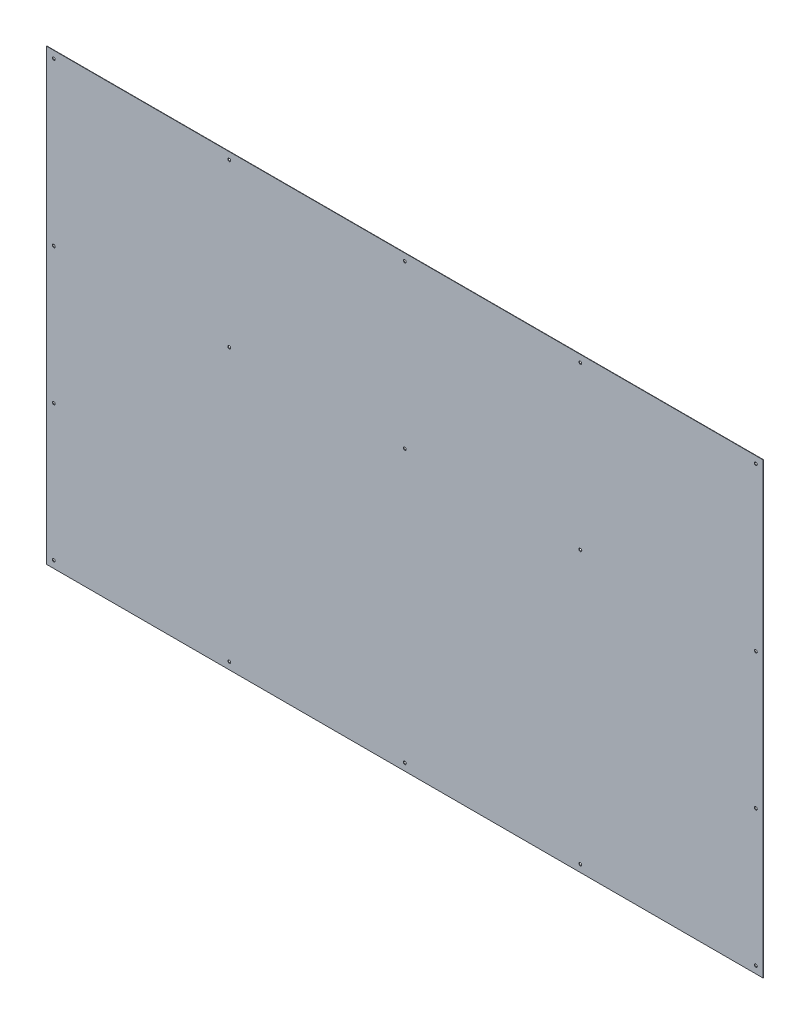
ISO-10303-21;
HEADER;
FILE_DESCRIPTION(('STEP AP214'),'2;1');
FILE_NAME('part.step','',(''),(''),'','','');
FILE_SCHEMA(('AUTOMOTIVE_DESIGN { 1 0 10303 214 1 1 1 1 }'));
ENDSEC;
DATA;
#1=APPLICATION_CONTEXT('core data for automotive mechanical design processes');
#2=APPLICATION_PROTOCOL_DEFINITION('international standard','automotive_design',2000,#1);
#3=PRODUCT_CONTEXT('',#1,'mechanical');
#4=PRODUCT('Part','Part','',(#3));
#5=PRODUCT_RELATED_PRODUCT_CATEGORY('part','',(#4));
#6=PRODUCT_DEFINITION_FORMATION('','',#4);
#7=PRODUCT_DEFINITION_CONTEXT('part definition',#1,'design');
#8=PRODUCT_DEFINITION('design','',#6,#7);
#9=PRODUCT_DEFINITION_SHAPE('','',#8);
#10=(LENGTH_UNIT() NAMED_UNIT(*) SI_UNIT(.MILLI.,.METRE.));
#11=(NAMED_UNIT(*) PLANE_ANGLE_UNIT() SI_UNIT($,.RADIAN.));
#12=(NAMED_UNIT(*) SI_UNIT($,.STERADIAN.) SOLID_ANGLE_UNIT());
#13=UNCERTAINTY_MEASURE_WITH_UNIT(LENGTH_MEASURE(1.E-05),#10,'distance_accuracy_value','');
#14=(GEOMETRIC_REPRESENTATION_CONTEXT(3) GLOBAL_UNCERTAINTY_ASSIGNED_CONTEXT((#13)) GLOBAL_UNIT_ASSIGNED_CONTEXT((#10,
#11,#12)) REPRESENTATION_CONTEXT('',''));
#15=CARTESIAN_POINT('',(0.,0.,0.));
#16=DIRECTION('',(0.,0.,1.));
#17=DIRECTION('',(1.,0.,0.));
#18=AXIS2_PLACEMENT_3D('',#15,#16,#17);
#19=CARTESIAN_POINT('',(0.,0.,1.));
#20=DIRECTION('',(0.,0.,-1.));
#21=DIRECTION('',(-1.,0.,0.));
#22=AXIS2_PLACEMENT_3D('',#19,#20,#21);
#23=PLANE('',#22);
#24=CARTESIAN_POINT('',(490.000000000004,153.5,1.));
#25=DIRECTION('',(0.,0.,-1.));
#26=DIRECTION('',(-1.,0.,0.));
#27=AXIS2_PLACEMENT_3D('',#24,#25,#26);
#28=CIRCLE('',#27,4.);
#29=CARTESIAN_POINT('',(486.000000000004,153.5,1.));
#30=VERTEX_POINT('',#29);
#31=EDGE_CURVE('E11',#30,#30,#28,.T.);
#32=ORIENTED_EDGE('',*,*,#31,.T.);
#33=EDGE_LOOP('',(#32));
#34=FACE_BOUND('',#33,.T.);
#35=CARTESIAN_POINT('',(4.6339008370253E-12,153.5,1.));
#36=DIRECTION('',(0.,0.,-1.));
#37=DIRECTION('',(-1.,0.,0.));
#38=AXIS2_PLACEMENT_3D('',#35,#36,#37);
#39=CIRCLE('',#38,4.00000000000023);
#40=CARTESIAN_POINT('',(-3.99999999999559,153.5,1.));
#41=VERTEX_POINT('',#40);
#42=EDGE_CURVE('E49',#41,#41,#39,.T.);
#43=ORIENTED_EDGE('',*,*,#42,.T.);
#44=EDGE_LOOP('',(#43));
#45=FACE_BOUND('',#44,.T.);
#46=CARTESIAN_POINT('',(-489.999999999995,153.5,1.));
#47=DIRECTION('',(0.,0.,-1.));
#48=DIRECTION('',(-1.,0.,0.));
#49=AXIS2_PLACEMENT_3D('',#46,#47,#48);
#50=CIRCLE('',#49,4.);
#51=CARTESIAN_POINT('',(-493.999999999995,153.5,1.));
#52=VERTEX_POINT('',#51);
#53=EDGE_CURVE('E184',#52,#52,#50,.T.);
#54=ORIENTED_EDGE('',*,*,#53,.T.);
#55=EDGE_LOOP('',(#54));
#56=FACE_BOUND('',#55,.T.);
#57=CARTESIAN_POINT('',(-979.999999999995,153.5,1.));
#58=DIRECTION('',(0.,0.,-1.));
#59=DIRECTION('',(-1.,0.,0.));
#60=AXIS2_PLACEMENT_3D('',#57,#58,#59);
#61=CIRCLE('',#60,4.00000000000023);
#62=CARTESIAN_POINT('',(-983.999999999995,153.5,1.));
#63=VERTEX_POINT('',#62);
#64=EDGE_CURVE('E180',#63,#63,#61,.T.);
#65=ORIENTED_EDGE('',*,*,#64,.T.);
#66=EDGE_LOOP('',(#65));
#67=FACE_BOUND('',#66,.T.);
#68=CARTESIAN_POINT('',(-979.999999999998,-226.5,1.));
#69=DIRECTION('',(0.,0.,-1.));
#70=DIRECTION('',(-1.,0.,0.));
#71=AXIS2_PLACEMENT_3D('',#68,#69,#70);
#72=CIRCLE('',#71,4.00000000000023);
#73=CARTESIAN_POINT('',(-983.999999999998,-226.5,1.));
#74=VERTEX_POINT('',#73);
#75=EDGE_CURVE('E176',#74,#74,#72,.T.);
#76=ORIENTED_EDGE('',*,*,#75,.T.);
#77=EDGE_LOOP('',(#76));
#78=FACE_BOUND('',#77,.T.);
#79=CARTESIAN_POINT('',(-980.,-606.5,1.));
#80=DIRECTION('',(0.,0.,-1.));
#81=DIRECTION('',(-1.,0.,0.));
#82=AXIS2_PLACEMENT_3D('',#79,#80,#81);
#83=CIRCLE('',#82,4.00000000000023);
#84=CARTESIAN_POINT('',(-984.,-606.5,1.));
#85=VERTEX_POINT('',#84);
#86=EDGE_CURVE('E172',#85,#85,#83,.T.);
#87=ORIENTED_EDGE('',*,*,#86,.T.);
#88=EDGE_LOOP('',(#87));
#89=FACE_BOUND('',#88,.T.);
#90=CARTESIAN_POINT('',(-490.,-606.5,1.));
#91=DIRECTION('',(0.,0.,-1.));
#92=DIRECTION('',(-1.,0.,0.));
#93=AXIS2_PLACEMENT_3D('',#90,#91,#92);
#94=CIRCLE('',#93,4.);
#95=CARTESIAN_POINT('',(-494.,-606.5,1.));
#96=VERTEX_POINT('',#95);
#97=EDGE_CURVE('E168',#96,#96,#94,.T.);
#98=ORIENTED_EDGE('',*,*,#97,.T.);
#99=EDGE_LOOP('',(#98));
#100=FACE_BOUND('',#99,.T.);
#101=CARTESIAN_POINT('',(-2.22044604925031E-13,-606.5,1.));
#102=DIRECTION('',(0.,0.,-1.));
#103=DIRECTION('',(-1.,0.,0.));
#104=AXIS2_PLACEMENT_3D('',#101,#102,#103);
#105=CIRCLE('',#104,4.00000000000023);
#106=CARTESIAN_POINT('',(-4.00000000000045,-606.5,1.));
#107=VERTEX_POINT('',#106);
#108=EDGE_CURVE('E164',#107,#107,#105,.T.);
#109=ORIENTED_EDGE('',*,*,#108,.T.);
#110=EDGE_LOOP('',(#109));
#111=FACE_BOUND('',#110,.T.);
#112=CARTESIAN_POINT('',(490.,-606.5,1.));
#113=DIRECTION('',(0.,0.,-1.));
#114=DIRECTION('',(-1.,0.,0.));
#115=AXIS2_PLACEMENT_3D('',#112,#113,#114);
#116=CIRCLE('',#115,4.);
#117=CARTESIAN_POINT('',(486.,-606.5,1.));
#118=VERTEX_POINT('',#117);
#119=EDGE_CURVE('E160',#118,#118,#116,.T.);
#120=ORIENTED_EDGE('',*,*,#119,.T.);
#121=EDGE_LOOP('',(#120));
#122=FACE_BOUND('',#121,.T.);
#123=CARTESIAN_POINT('',(980.,-606.5,1.));
#124=DIRECTION('',(0.,0.,-1.));
#125=DIRECTION('',(-1.,0.,0.));
#126=AXIS2_PLACEMENT_3D('',#123,#124,#125);
#127=CIRCLE('',#126,4.00000000000023);
#128=CARTESIAN_POINT('',(975.999999999999,-606.5,1.));
#129=VERTEX_POINT('',#128);
#130=EDGE_CURVE('E156',#129,#129,#127,.T.);
#131=ORIENTED_EDGE('',*,*,#130,.T.);
#132=EDGE_LOOP('',(#131));
#133=FACE_BOUND('',#132,.T.);
#134=CARTESIAN_POINT('',(980.000000000002,-226.5,1.));
#135=DIRECTION('',(0.,0.,-1.));
#136=DIRECTION('',(-1.,0.,0.));
#137=AXIS2_PLACEMENT_3D('',#134,#135,#136);
#138=CIRCLE('',#137,4.00000000000023);
#139=CARTESIAN_POINT('',(976.000000000002,-226.5,1.));
#140=VERTEX_POINT('',#139);
#141=EDGE_CURVE('E152',#140,#140,#138,.T.);
#142=ORIENTED_EDGE('',*,*,#141,.T.);
#143=EDGE_LOOP('',(#142));
#144=FACE_BOUND('',#143,.T.);
#145=CARTESIAN_POINT('',(980.000000000004,153.5,1.));
#146=DIRECTION('',(0.,0.,-1.));
#147=DIRECTION('',(-1.,0.,0.));
#148=AXIS2_PLACEMENT_3D('',#145,#146,#147);
#149=CIRCLE('',#148,4.00000000000023);
#150=CARTESIAN_POINT('',(976.000000000004,153.5,1.));
#151=VERTEX_POINT('',#150);
#152=EDGE_CURVE('E148',#151,#151,#149,.T.);
#153=ORIENTED_EDGE('',*,*,#152,.T.);
#154=EDGE_LOOP('',(#153));
#155=FACE_BOUND('',#154,.T.);
#156=CARTESIAN_POINT('',(980.,606.5,1.));
#157=DIRECTION('',(0.,0.,-1.));
#158=DIRECTION('',(-1.,0.,0.));
#159=AXIS2_PLACEMENT_3D('',#156,#157,#158);
#160=CIRCLE('',#159,4.00000000000023);
#161=CARTESIAN_POINT('',(975.999999999999,606.5,1.));
#162=VERTEX_POINT('',#161);
#163=EDGE_CURVE('E144',#162,#162,#160,.T.);
#164=ORIENTED_EDGE('',*,*,#163,.T.);
#165=EDGE_LOOP('',(#164));
#166=FACE_BOUND('',#165,.T.);
#167=CARTESIAN_POINT('',(490.,606.5,1.));
#168=DIRECTION('',(0.,0.,-1.));
#169=DIRECTION('',(-1.,0.,0.));
#170=AXIS2_PLACEMENT_3D('',#167,#168,#169);
#171=CIRCLE('',#170,4.);
#172=CARTESIAN_POINT('',(486.,606.5,1.));
#173=VERTEX_POINT('',#172);
#174=EDGE_CURVE('E140',#173,#173,#171,.T.);
#175=ORIENTED_EDGE('',*,*,#174,.T.);
#176=EDGE_LOOP('',(#175));
#177=FACE_BOUND('',#176,.T.);
#178=CARTESIAN_POINT('',(-1.11022302462516E-13,606.5,1.));
#179=DIRECTION('',(0.,0.,-1.));
#180=DIRECTION('',(-1.,0.,0.));
#181=AXIS2_PLACEMENT_3D('',#178,#179,#180);
#182=CIRCLE('',#181,4.00000000000023);
#183=CARTESIAN_POINT('',(-4.00000000000034,606.5,1.));
#184=VERTEX_POINT('',#183);
#185=EDGE_CURVE('E136',#184,#184,#182,.T.);
#186=ORIENTED_EDGE('',*,*,#185,.T.);
#187=EDGE_LOOP('',(#186));
#188=FACE_BOUND('',#187,.T.);
#189=CARTESIAN_POINT('',(-490.,606.5,1.));
#190=DIRECTION('',(0.,0.,-1.));
#191=DIRECTION('',(-1.,0.,0.));
#192=AXIS2_PLACEMENT_3D('',#189,#190,#191);
#193=CIRCLE('',#192,4.);
#194=CARTESIAN_POINT('',(-494.,606.5,1.));
#195=VERTEX_POINT('',#194);
#196=EDGE_CURVE('E132',#195,#195,#193,.T.);
#197=ORIENTED_EDGE('',*,*,#196,.T.);
#198=EDGE_LOOP('',(#197));
#199=FACE_BOUND('',#198,.T.);
#200=CARTESIAN_POINT('',(-980.,606.5,1.));
#201=DIRECTION('',(0.,0.,-1.));
#202=DIRECTION('',(-1.,0.,0.));
#203=AXIS2_PLACEMENT_3D('',#200,#201,#202);
#204=CIRCLE('',#203,4.00000000000023);
#205=CARTESIAN_POINT('',(-984.,606.5,1.));
#206=VERTEX_POINT('',#205);
#207=EDGE_CURVE('E128',#206,#206,#204,.T.);
#208=ORIENTED_EDGE('',*,*,#207,.T.);
#209=EDGE_LOOP('',(#208));
#210=FACE_BOUND('',#209,.T.);
#211=DIRECTION('',(0.,-1.,0.));
#212=VECTOR('',#211,1.);
#213=CARTESIAN_POINT('',(-1000.,626.5,1.));
#214=LINE('',#213,#212);
#215=CARTESIAN_POINT('',(-1000.,626.5,1.));
#216=VERTEX_POINT('',#215);
#217=CARTESIAN_POINT('',(-1000.,-626.5,1.));
#218=VERTEX_POINT('',#217);
#219=EDGE_CURVE('E92',#216,#218,#214,.T.);
#220=ORIENTED_EDGE('',*,*,#219,.T.);
#221=DIRECTION('',(1.,0.,0.));
#222=VECTOR('',#221,1.);
#223=CARTESIAN_POINT('',(1000.,-626.5,1.));
#224=LINE('',#223,#222);
#225=CARTESIAN_POINT('',(1000.,-626.5,1.));
#226=VERTEX_POINT('',#225);
#227=EDGE_CURVE('E88',#218,#226,#224,.T.);
#228=ORIENTED_EDGE('',*,*,#227,.T.);
#229=DIRECTION('',(0.,1.,0.));
#230=VECTOR('',#229,1.);
#231=CARTESIAN_POINT('',(1000.,626.5,1.));
#232=LINE('',#231,#230);
#233=CARTESIAN_POINT('',(1000.,626.5,1.));
#234=VERTEX_POINT('',#233);
#235=EDGE_CURVE('E90',#226,#234,#232,.T.);
#236=ORIENTED_EDGE('',*,*,#235,.T.);
#237=DIRECTION('',(-1.,0.,0.));
#238=VECTOR('',#237,1.);
#239=CARTESIAN_POINT('',(1000.,626.5,1.));
#240=LINE('',#239,#238);
#241=EDGE_CURVE('E57',#234,#216,#240,.T.);
#242=ORIENTED_EDGE('',*,*,#241,.T.);
#243=EDGE_LOOP('',(#220,#228,#236,#242));
#244=FACE_BOUND('',#243,.T.);
#245=ADVANCED_FACE('F39',(#34,#45,#56,#67,#78,#89,#100,#111,#122,#133,#144,#155,#166,#177,#188,
#199,#210,#244),#23,.F.);
#246=CARTESIAN_POINT('',(0.,0.,0.));
#247=DIRECTION('',(0.,0.,-1.));
#248=DIRECTION('',(-1.,0.,0.));
#249=AXIS2_PLACEMENT_3D('',#246,#247,#248);
#250=PLANE('',#249);
#251=CARTESIAN_POINT('',(-489.999999999995,153.5,0.));
#252=DIRECTION('',(0.,0.,1.));
#253=DIRECTION('',(1.,0.,0.));
#254=AXIS2_PLACEMENT_3D('',#251,#252,#253);
#255=CIRCLE('',#254,2.99999999999999);
#256=CARTESIAN_POINT('',(-486.999999999995,153.5,0.));
#257=VERTEX_POINT('',#256);
#258=EDGE_CURVE('E205',#257,#257,#255,.T.);
#259=ORIENTED_EDGE('',*,*,#258,.T.);
#260=EDGE_LOOP('',(#259));
#261=FACE_BOUND('',#260,.T.);
#262=CARTESIAN_POINT('',(980.000000000004,153.5,0.));
#263=DIRECTION('',(0.,0.,1.));
#264=DIRECTION('',(1.,0.,0.));
#265=AXIS2_PLACEMENT_3D('',#262,#263,#264);
#266=CIRCLE('',#265,3.00000000000005);
#267=CARTESIAN_POINT('',(983.000000000004,153.5,0.));
#268=VERTEX_POINT('',#267);
#269=EDGE_CURVE('E204',#268,#268,#266,.T.);
#270=ORIENTED_EDGE('',*,*,#269,.T.);
#271=EDGE_LOOP('',(#270));
#272=FACE_BOUND('',#271,.T.);
#273=CARTESIAN_POINT('',(490.,606.5,0.));
#274=DIRECTION('',(0.,0.,1.));
#275=DIRECTION('',(1.,0.,0.));
#276=AXIS2_PLACEMENT_3D('',#273,#274,#275);
#277=CIRCLE('',#276,2.99999999999999);
#278=CARTESIAN_POINT('',(493.,606.5,0.));
#279=VERTEX_POINT('',#278);
#280=EDGE_CURVE('E220',#279,#279,#277,.T.);
#281=ORIENTED_EDGE('',*,*,#280,.T.);
#282=EDGE_LOOP('',(#281));
#283=FACE_BOUND('',#282,.T.);
#284=CARTESIAN_POINT('',(490.,-606.5,0.));
#285=DIRECTION('',(0.,0.,1.));
#286=DIRECTION('',(1.,0.,0.));
#287=AXIS2_PLACEMENT_3D('',#284,#285,#286);
#288=CIRCLE('',#287,2.99999999999999);
#289=CARTESIAN_POINT('',(493.,-606.5,0.));
#290=VERTEX_POINT('',#289);
#291=EDGE_CURVE('E228',#290,#290,#288,.T.);
#292=ORIENTED_EDGE('',*,*,#291,.T.);
#293=EDGE_LOOP('',(#292));
#294=FACE_BOUND('',#293,.T.);
#295=CARTESIAN_POINT('',(-979.999999999998,-226.5,0.));
#296=DIRECTION('',(0.,0.,1.));
#297=DIRECTION('',(1.,0.,0.));
#298=AXIS2_PLACEMENT_3D('',#295,#296,#297);
#299=CIRCLE('',#298,3.00000000000005);
#300=CARTESIAN_POINT('',(-976.999999999998,-226.5,0.));
#301=VERTEX_POINT('',#300);
#302=EDGE_CURVE('E236',#301,#301,#299,.T.);
#303=ORIENTED_EDGE('',*,*,#302,.T.);
#304=EDGE_LOOP('',(#303));
#305=FACE_BOUND('',#304,.T.);
#306=CARTESIAN_POINT('',(-2.22044604925031E-13,-606.5,0.));
#307=DIRECTION('',(0.,0.,1.));
#308=DIRECTION('',(1.,0.,0.));
#309=AXIS2_PLACEMENT_3D('',#306,#307,#308);
#310=CIRCLE('',#309,3.);
#311=CARTESIAN_POINT('',(2.99999999999978,-606.5,0.));
#312=VERTEX_POINT('',#311);
#313=EDGE_CURVE('E244',#312,#312,#310,.T.);
#314=ORIENTED_EDGE('',*,*,#313,.T.);
#315=EDGE_LOOP('',(#314));
#316=FACE_BOUND('',#315,.T.);
#317=CARTESIAN_POINT('',(-980.,-606.5,0.));
#318=DIRECTION('',(0.,0.,1.));
#319=DIRECTION('',(1.,0.,0.));
#320=AXIS2_PLACEMENT_3D('',#317,#318,#319);
#321=CIRCLE('',#320,3.00000000000005);
#322=CARTESIAN_POINT('',(-977.,-606.5,0.));
#323=VERTEX_POINT('',#322);
#324=EDGE_CURVE('E252',#323,#323,#321,.T.);
#325=ORIENTED_EDGE('',*,*,#324,.T.);
#326=EDGE_LOOP('',(#325));
#327=FACE_BOUND('',#326,.T.);
#328=CARTESIAN_POINT('',(980.,606.5,0.));
#329=DIRECTION('',(0.,0.,1.));
#330=DIRECTION('',(1.,0.,0.));
#331=AXIS2_PLACEMENT_3D('',#328,#329,#330);
#332=CIRCLE('',#331,3.00000000000005);
#333=CARTESIAN_POINT('',(983.,606.5,0.));
#334=VERTEX_POINT('',#333);
#335=EDGE_CURVE('E260',#334,#334,#332,.T.);
#336=ORIENTED_EDGE('',*,*,#335,.T.);
#337=EDGE_LOOP('',(#336));
#338=FACE_BOUND('',#337,.T.);
#339=DIRECTION('',(0.,-1.,0.));
#340=VECTOR('',#339,1.);
#341=CARTESIAN_POINT('',(-1000.,626.5,0.));
#342=LINE('',#341,#340);
#343=CARTESIAN_POINT('',(-1000.,626.5,0.));
#344=VERTEX_POINT('',#343);
#345=CARTESIAN_POINT('',(-1000.,-626.5,0.));
#346=VERTEX_POINT('',#345);
#347=EDGE_CURVE('E111',#344,#346,#342,.T.);
#348=ORIENTED_EDGE('',*,*,#347,.F.);
#349=DIRECTION('',(-1.,0.,0.));
#350=VECTOR('',#349,1.);
#351=CARTESIAN_POINT('',(1000.,626.5,0.));
#352=LINE('',#351,#350);
#353=CARTESIAN_POINT('',(1000.,626.5,0.));
#354=VERTEX_POINT('',#353);
#355=EDGE_CURVE('E80',#354,#344,#352,.T.);
#356=ORIENTED_EDGE('',*,*,#355,.F.);
#357=DIRECTION('',(0.,1.,0.));
#358=VECTOR('',#357,1.);
#359=CARTESIAN_POINT('',(1000.,626.5,0.));
#360=LINE('',#359,#358);
#361=CARTESIAN_POINT('',(1000.,-626.5,0.));
#362=VERTEX_POINT('',#361);
#363=EDGE_CURVE('E74',#362,#354,#360,.T.);
#364=ORIENTED_EDGE('',*,*,#363,.F.);
#365=DIRECTION('',(1.,0.,0.));
#366=VECTOR('',#365,1.);
#367=CARTESIAN_POINT('',(1000.,-626.5,0.));
#368=LINE('',#367,#366);
#369=EDGE_CURVE('E98',#346,#362,#368,.T.);
#370=ORIENTED_EDGE('',*,*,#369,.F.);
#371=EDGE_LOOP('',(#348,#356,#364,#370));
#372=FACE_BOUND('',#371,.T.);
#373=CARTESIAN_POINT('',(-980.,606.5,0.));
#374=DIRECTION('',(0.,0.,1.));
#375=DIRECTION('',(1.,0.,0.));
#376=AXIS2_PLACEMENT_3D('',#373,#374,#375);
#377=CIRCLE('',#376,3.00000000000005);
#378=CARTESIAN_POINT('',(-977.,606.5,0.));
#379=VERTEX_POINT('',#378);
#380=EDGE_CURVE('E115',#379,#379,#377,.T.);
#381=ORIENTED_EDGE('',*,*,#380,.T.);
#382=EDGE_LOOP('',(#381));
#383=FACE_BOUND('',#382,.T.);
#384=CARTESIAN_POINT('',(-1.11022302462516E-13,606.5,0.));
#385=DIRECTION('',(0.,0.,1.));
#386=DIRECTION('',(1.,0.,0.));
#387=AXIS2_PLACEMENT_3D('',#384,#385,#386);
#388=CIRCLE('',#387,3.);
#389=CARTESIAN_POINT('',(2.99999999999989,606.5,0.));
#390=VERTEX_POINT('',#389);
#391=EDGE_CURVE('E256',#390,#390,#388,.T.);
#392=ORIENTED_EDGE('',*,*,#391,.T.);
#393=EDGE_LOOP('',(#392));
#394=FACE_BOUND('',#393,.T.);
#395=CARTESIAN_POINT('',(980.,-606.5,0.));
#396=DIRECTION('',(0.,0.,1.));
#397=DIRECTION('',(1.,0.,0.));
#398=AXIS2_PLACEMENT_3D('',#395,#396,#397);
#399=CIRCLE('',#398,3.00000000000005);
#400=CARTESIAN_POINT('',(983.,-606.5,0.));
#401=VERTEX_POINT('',#400);
#402=EDGE_CURVE('E248',#401,#401,#399,.T.);
#403=ORIENTED_EDGE('',*,*,#402,.T.);
#404=EDGE_LOOP('',(#403));
#405=FACE_BOUND('',#404,.T.);
#406=CARTESIAN_POINT('',(980.000000000002,-226.5,0.));
#407=DIRECTION('',(0.,0.,1.));
#408=DIRECTION('',(1.,0.,0.));
#409=AXIS2_PLACEMENT_3D('',#406,#407,#408);
#410=CIRCLE('',#409,3.00000000000005);
#411=CARTESIAN_POINT('',(983.000000000002,-226.5,0.));
#412=VERTEX_POINT('',#411);
#413=EDGE_CURVE('E240',#412,#412,#410,.T.);
#414=ORIENTED_EDGE('',*,*,#413,.T.);
#415=EDGE_LOOP('',(#414));
#416=FACE_BOUND('',#415,.T.);
#417=CARTESIAN_POINT('',(-490.,-606.5,0.));
#418=DIRECTION('',(0.,0.,1.));
#419=DIRECTION('',(1.,0.,0.));
#420=AXIS2_PLACEMENT_3D('',#417,#418,#419);
#421=CIRCLE('',#420,2.99999999999999);
#422=CARTESIAN_POINT('',(-487.,-606.5,0.));
#423=VERTEX_POINT('',#422);
#424=EDGE_CURVE('E232',#423,#423,#421,.T.);
#425=ORIENTED_EDGE('',*,*,#424,.T.);
#426=EDGE_LOOP('',(#425));
#427=FACE_BOUND('',#426,.T.);
#428=CARTESIAN_POINT('',(-490.,606.5,0.));
#429=DIRECTION('',(0.,0.,1.));
#430=DIRECTION('',(1.,0.,0.));
#431=AXIS2_PLACEMENT_3D('',#428,#429,#430);
#432=CIRCLE('',#431,2.99999999999999);
#433=CARTESIAN_POINT('',(-487.,606.5,0.));
#434=VERTEX_POINT('',#433);
#435=EDGE_CURVE('E224',#434,#434,#432,.T.);
#436=ORIENTED_EDGE('',*,*,#435,.T.);
#437=EDGE_LOOP('',(#436));
#438=FACE_BOUND('',#437,.T.);
#439=CARTESIAN_POINT('',(-979.999999999995,153.5,0.));
#440=DIRECTION('',(0.,0.,1.));
#441=DIRECTION('',(1.,0.,0.));
#442=AXIS2_PLACEMENT_3D('',#439,#440,#441);
#443=CIRCLE('',#442,3.00000000000005);
#444=CARTESIAN_POINT('',(-976.999999999995,153.5,0.));
#445=VERTEX_POINT('',#444);
#446=EDGE_CURVE('E210',#445,#445,#443,.T.);
#447=ORIENTED_EDGE('',*,*,#446,.T.);
#448=EDGE_LOOP('',(#447));
#449=FACE_BOUND('',#448,.T.);
#450=CARTESIAN_POINT('',(4.6339008370253E-12,153.5,0.));
#451=DIRECTION('',(0.,0.,1.));
#452=DIRECTION('',(1.,0.,0.));
#453=AXIS2_PLACEMENT_3D('',#450,#451,#452);
#454=CIRCLE('',#453,3.);
#455=CARTESIAN_POINT('',(3.00000000000463,153.5,0.));
#456=VERTEX_POINT('',#455);
#457=EDGE_CURVE('E201',#456,#456,#454,.T.);
#458=ORIENTED_EDGE('',*,*,#457,.T.);
#459=EDGE_LOOP('',(#458));
#460=FACE_BOUND('',#459,.T.);
#461=CARTESIAN_POINT('',(490.000000000004,153.5,0.));
#462=DIRECTION('',(0.,0.,1.));
#463=DIRECTION('',(1.,0.,0.));
#464=AXIS2_PLACEMENT_3D('',#461,#462,#463);
#465=CIRCLE('',#464,2.99999999999999);
#466=CARTESIAN_POINT('',(493.000000000004,153.5,0.));
#467=VERTEX_POINT('',#466);
#468=EDGE_CURVE('E213',#467,#467,#465,.T.);
#469=ORIENTED_EDGE('',*,*,#468,.T.);
#470=EDGE_LOOP('',(#469));
#471=FACE_BOUND('',#470,.T.);
#472=ADVANCED_FACE('F269',(#261,#272,#283,#294,#305,#316,#327,#338,#372,#383,#394,#405,#416,
#427,#438,#449,#460,#471),#250,.T.);
#473=CARTESIAN_POINT('',(-1000.,626.5,1.));
#474=DIRECTION('',(1.,0.,0.));
#475=DIRECTION('',(0.,0.,-1.));
#476=AXIS2_PLACEMENT_3D('',#473,#474,#475);
#477=PLANE('',#476);
#478=ORIENTED_EDGE('',*,*,#347,.T.);
#479=DIRECTION('',(0.,0.,-1.));
#480=VECTOR('',#479,1.);
#481=CARTESIAN_POINT('',(-1000.,-626.5,1.));
#482=LINE('',#481,#480);
#483=EDGE_CURVE('E100',#218,#346,#482,.T.);
#484=ORIENTED_EDGE('',*,*,#483,.F.);
#485=ORIENTED_EDGE('',*,*,#219,.F.);
#486=DIRECTION('',(0.,0.,-1.));
#487=VECTOR('',#486,1.);
#488=CARTESIAN_POINT('',(-1000.,626.5,1.));
#489=LINE('',#488,#487);
#490=EDGE_CURVE('E107',#216,#344,#489,.T.);
#491=ORIENTED_EDGE('',*,*,#490,.T.);
#492=EDGE_LOOP('',(#478,#484,#485,#491));
#493=FACE_BOUND('',#492,.T.);
#494=ADVANCED_FACE('F287',(#493),#477,.F.);
#495=CARTESIAN_POINT('',(1000.,-626.5,1.));
#496=DIRECTION('',(0.,1.,0.));
#497=DIRECTION('',(-1.,0.,0.));
#498=AXIS2_PLACEMENT_3D('',#495,#496,#497);
#499=PLANE('',#498);
#500=ORIENTED_EDGE('',*,*,#369,.T.);
#501=DIRECTION('',(0.,0.,-1.));
#502=VECTOR('',#501,1.);
#503=CARTESIAN_POINT('',(1000.,-626.5,1.));
#504=LINE('',#503,#502);
#505=EDGE_CURVE('E96',#226,#362,#504,.T.);
#506=ORIENTED_EDGE('',*,*,#505,.F.);
#507=ORIENTED_EDGE('',*,*,#227,.F.);
#508=ORIENTED_EDGE('',*,*,#483,.T.);
#509=EDGE_LOOP('',(#500,#506,#507,#508));
#510=FACE_BOUND('',#509,.T.);
#511=ADVANCED_FACE('F97',(#510),#499,.F.);
#512=CARTESIAN_POINT('',(1000.,626.5,1.));
#513=DIRECTION('',(-1.,0.,0.));
#514=DIRECTION('',(0.,-1.,0.));
#515=AXIS2_PLACEMENT_3D('',#512,#513,#514);
#516=PLANE('',#515);
#517=ORIENTED_EDGE('',*,*,#363,.T.);
#518=DIRECTION('',(0.,0.,-1.));
#519=VECTOR('',#518,1.);
#520=CARTESIAN_POINT('',(1000.,626.5,1.));
#521=LINE('',#520,#519);
#522=EDGE_CURVE('E101',#234,#354,#521,.T.);
#523=ORIENTED_EDGE('',*,*,#522,.F.);
#524=ORIENTED_EDGE('',*,*,#235,.F.);
#525=ORIENTED_EDGE('',*,*,#505,.T.);
#526=EDGE_LOOP('',(#517,#523,#524,#525));
#527=FACE_BOUND('',#526,.T.);
#528=ADVANCED_FACE('F103',(#527),#516,.F.);
#529=CARTESIAN_POINT('',(1000.,626.5,1.));
#530=DIRECTION('',(0.,-1.,0.));
#531=DIRECTION('',(1.,0.,0.));
#532=AXIS2_PLACEMENT_3D('',#529,#530,#531);
#533=PLANE('',#532);
#534=ORIENTED_EDGE('',*,*,#355,.T.);
#535=ORIENTED_EDGE('',*,*,#490,.F.);
#536=ORIENTED_EDGE('',*,*,#241,.F.);
#537=ORIENTED_EDGE('',*,*,#522,.T.);
#538=EDGE_LOOP('',(#534,#535,#536,#537));
#539=FACE_BOUND('',#538,.T.);
#540=ADVANCED_FACE('F291',(#539),#533,.F.);
#541=CARTESIAN_POINT('',(490.000000000004,153.5,0.));
#542=DIRECTION('',(0.,0.,1.));
#543=DIRECTION('',(1.,0.,0.));
#544=AXIS2_PLACEMENT_3D('',#541,#542,#543);
#545=CONICAL_SURFACE('',#544,2.99999999999999,0.785398163397443);
#546=ORIENTED_EDGE('',*,*,#31,.F.);
#547=EDGE_LOOP('',(#546));
#548=FACE_BOUND('',#547,.T.);
#549=ORIENTED_EDGE('',*,*,#468,.F.);
#550=EDGE_LOOP('',(#549));
#551=FACE_BOUND('',#550,.T.);
#552=ADVANCED_FACE('F197',(#548,#551),#545,.F.);
#553=CARTESIAN_POINT('',(4.6339008370253E-12,153.5,0.));
#554=DIRECTION('',(0.,0.,1.));
#555=DIRECTION('',(1.,0.,0.));
#556=AXIS2_PLACEMENT_3D('',#553,#554,#555);
#557=CONICAL_SURFACE('',#556,3.,0.785398163397554);
#558=ORIENTED_EDGE('',*,*,#42,.F.);
#559=EDGE_LOOP('',(#558));
#560=FACE_BOUND('',#559,.T.);
#561=ORIENTED_EDGE('',*,*,#457,.F.);
#562=EDGE_LOOP('',(#561));
#563=FACE_BOUND('',#562,.T.);
#564=ADVANCED_FACE('F193',(#560,#563),#557,.F.);
#565=CARTESIAN_POINT('',(-489.999999999995,153.5,0.));
#566=DIRECTION('',(0.,0.,1.));
#567=DIRECTION('',(1.,0.,0.));
#568=AXIS2_PLACEMENT_3D('',#565,#566,#567);
#569=CONICAL_SURFACE('',#568,2.99999999999999,0.785398163397443);
#570=ORIENTED_EDGE('',*,*,#53,.F.);
#571=EDGE_LOOP('',(#570));
#572=FACE_BOUND('',#571,.T.);
#573=ORIENTED_EDGE('',*,*,#258,.F.);
#574=EDGE_LOOP('',(#573));
#575=FACE_BOUND('',#574,.T.);
#576=ADVANCED_FACE('F196',(#572,#575),#569,.F.);
#577=CARTESIAN_POINT('',(-979.999999999995,153.5,0.));
#578=DIRECTION('',(0.,0.,1.));
#579=DIRECTION('',(1.,0.,0.));
#580=AXIS2_PLACEMENT_3D('',#577,#578,#579);
#581=CONICAL_SURFACE('',#580,3.00000000000005,0.785398163397554);
#582=ORIENTED_EDGE('',*,*,#64,.F.);
#583=EDGE_LOOP('',(#582));
#584=FACE_BOUND('',#583,.T.);
#585=ORIENTED_EDGE('',*,*,#446,.F.);
#586=EDGE_LOOP('',(#585));
#587=FACE_BOUND('',#586,.T.);
#588=ADVANCED_FACE('F306',(#584,#587),#581,.F.);
#589=CARTESIAN_POINT('',(-979.999999999998,-226.5,0.));
#590=DIRECTION('',(0.,0.,1.));
#591=DIRECTION('',(1.,0.,0.));
#592=AXIS2_PLACEMENT_3D('',#589,#590,#591);
#593=CONICAL_SURFACE('',#592,3.00000000000005,0.785398163397554);
#594=ORIENTED_EDGE('',*,*,#75,.F.);
#595=EDGE_LOOP('',(#594));
#596=FACE_BOUND('',#595,.T.);
#597=ORIENTED_EDGE('',*,*,#302,.F.);
#598=EDGE_LOOP('',(#597));
#599=FACE_BOUND('',#598,.T.);
#600=ADVANCED_FACE('F310',(#596,#599),#593,.F.);
#601=CARTESIAN_POINT('',(-980.,-606.5,0.));
#602=DIRECTION('',(0.,0.,1.));
#603=DIRECTION('',(1.,0.,0.));
#604=AXIS2_PLACEMENT_3D('',#601,#602,#603);
#605=CONICAL_SURFACE('',#604,3.00000000000005,0.785398163397554);
#606=ORIENTED_EDGE('',*,*,#86,.F.);
#607=EDGE_LOOP('',(#606));
#608=FACE_BOUND('',#607,.T.);
#609=ORIENTED_EDGE('',*,*,#324,.F.);
#610=EDGE_LOOP('',(#609));
#611=FACE_BOUND('',#610,.T.);
#612=ADVANCED_FACE('F314',(#608,#611),#605,.F.);
#613=CARTESIAN_POINT('',(-490.,-606.5,0.));
#614=DIRECTION('',(0.,0.,1.));
#615=DIRECTION('',(1.,0.,0.));
#616=AXIS2_PLACEMENT_3D('',#613,#614,#615);
#617=CONICAL_SURFACE('',#616,2.99999999999999,0.785398163397443);
#618=ORIENTED_EDGE('',*,*,#97,.F.);
#619=EDGE_LOOP('',(#618));
#620=FACE_BOUND('',#619,.T.);
#621=ORIENTED_EDGE('',*,*,#424,.F.);
#622=EDGE_LOOP('',(#621));
#623=FACE_BOUND('',#622,.T.);
#624=ADVANCED_FACE('F318',(#620,#623),#617,.F.);
#625=CARTESIAN_POINT('',(-2.22044604925031E-13,-606.5,0.));
#626=DIRECTION('',(0.,0.,1.));
#627=DIRECTION('',(1.,0.,0.));
#628=AXIS2_PLACEMENT_3D('',#625,#626,#627);
#629=CONICAL_SURFACE('',#628,3.,0.785398163397554);
#630=ORIENTED_EDGE('',*,*,#108,.F.);
#631=EDGE_LOOP('',(#630));
#632=FACE_BOUND('',#631,.T.);
#633=ORIENTED_EDGE('',*,*,#313,.F.);
#634=EDGE_LOOP('',(#633));
#635=FACE_BOUND('',#634,.T.);
#636=ADVANCED_FACE('F322',(#632,#635),#629,.F.);
#637=CARTESIAN_POINT('',(490.,-606.5,0.));
#638=DIRECTION('',(0.,0.,1.));
#639=DIRECTION('',(1.,0.,0.));
#640=AXIS2_PLACEMENT_3D('',#637,#638,#639);
#641=CONICAL_SURFACE('',#640,2.99999999999999,0.785398163397443);
#642=ORIENTED_EDGE('',*,*,#119,.F.);
#643=EDGE_LOOP('',(#642));
#644=FACE_BOUND('',#643,.T.);
#645=ORIENTED_EDGE('',*,*,#291,.F.);
#646=EDGE_LOOP('',(#645));
#647=FACE_BOUND('',#646,.T.);
#648=ADVANCED_FACE('F326',(#644,#647),#641,.F.);
#649=CARTESIAN_POINT('',(980.,-606.5,0.));
#650=DIRECTION('',(0.,0.,1.));
#651=DIRECTION('',(1.,0.,0.));
#652=AXIS2_PLACEMENT_3D('',#649,#650,#651);
#653=CONICAL_SURFACE('',#652,3.00000000000005,0.785398163397554);
#654=ORIENTED_EDGE('',*,*,#130,.F.);
#655=EDGE_LOOP('',(#654));
#656=FACE_BOUND('',#655,.T.);
#657=ORIENTED_EDGE('',*,*,#402,.F.);
#658=EDGE_LOOP('',(#657));
#659=FACE_BOUND('',#658,.T.);
#660=ADVANCED_FACE('F330',(#656,#659),#653,.F.);
#661=CARTESIAN_POINT('',(980.000000000002,-226.5,0.));
#662=DIRECTION('',(0.,0.,1.));
#663=DIRECTION('',(1.,0.,0.));
#664=AXIS2_PLACEMENT_3D('',#661,#662,#663);
#665=CONICAL_SURFACE('',#664,3.00000000000005,0.785398163397554);
#666=ORIENTED_EDGE('',*,*,#141,.F.);
#667=EDGE_LOOP('',(#666));
#668=FACE_BOUND('',#667,.T.);
#669=ORIENTED_EDGE('',*,*,#413,.F.);
#670=EDGE_LOOP('',(#669));
#671=FACE_BOUND('',#670,.T.);
#672=ADVANCED_FACE('F334',(#668,#671),#665,.F.);
#673=CARTESIAN_POINT('',(980.000000000004,153.5,0.));
#674=DIRECTION('',(0.,0.,1.));
#675=DIRECTION('',(1.,0.,0.));
#676=AXIS2_PLACEMENT_3D('',#673,#674,#675);
#677=CONICAL_SURFACE('',#676,3.00000000000005,0.785398163397554);
#678=ORIENTED_EDGE('',*,*,#152,.F.);
#679=EDGE_LOOP('',(#678));
#680=FACE_BOUND('',#679,.T.);
#681=ORIENTED_EDGE('',*,*,#269,.F.);
#682=EDGE_LOOP('',(#681));
#683=FACE_BOUND('',#682,.T.);
#684=ADVANCED_FACE('F338',(#680,#683),#677,.F.);
#685=CARTESIAN_POINT('',(980.,606.5,0.));
#686=DIRECTION('',(0.,0.,1.));
#687=DIRECTION('',(1.,0.,0.));
#688=AXIS2_PLACEMENT_3D('',#685,#686,#687);
#689=CONICAL_SURFACE('',#688,3.00000000000005,0.785398163397554);
#690=ORIENTED_EDGE('',*,*,#163,.F.);
#691=EDGE_LOOP('',(#690));
#692=FACE_BOUND('',#691,.T.);
#693=ORIENTED_EDGE('',*,*,#335,.F.);
#694=EDGE_LOOP('',(#693));
#695=FACE_BOUND('',#694,.T.);
#696=ADVANCED_FACE('F342',(#692,#695),#689,.F.);
#697=CARTESIAN_POINT('',(490.,606.5,0.));
#698=DIRECTION('',(0.,0.,1.));
#699=DIRECTION('',(1.,0.,0.));
#700=AXIS2_PLACEMENT_3D('',#697,#698,#699);
#701=CONICAL_SURFACE('',#700,2.99999999999999,0.785398163397443);
#702=ORIENTED_EDGE('',*,*,#174,.F.);
#703=EDGE_LOOP('',(#702));
#704=FACE_BOUND('',#703,.T.);
#705=ORIENTED_EDGE('',*,*,#280,.F.);
#706=EDGE_LOOP('',(#705));
#707=FACE_BOUND('',#706,.T.);
#708=ADVANCED_FACE('F346',(#704,#707),#701,.F.);
#709=CARTESIAN_POINT('',(-1.11022302462516E-13,606.5,0.));
#710=DIRECTION('',(0.,0.,1.));
#711=DIRECTION('',(1.,0.,0.));
#712=AXIS2_PLACEMENT_3D('',#709,#710,#711);
#713=CONICAL_SURFACE('',#712,3.,0.785398163397554);
#714=ORIENTED_EDGE('',*,*,#185,.F.);
#715=EDGE_LOOP('',(#714));
#716=FACE_BOUND('',#715,.T.);
#717=ORIENTED_EDGE('',*,*,#391,.F.);
#718=EDGE_LOOP('',(#717));
#719=FACE_BOUND('',#718,.T.);
#720=ADVANCED_FACE('F278',(#716,#719),#713,.F.);
#721=CARTESIAN_POINT('',(-490.,606.5,0.));
#722=DIRECTION('',(0.,0.,1.));
#723=DIRECTION('',(1.,0.,0.));
#724=AXIS2_PLACEMENT_3D('',#721,#722,#723);
#725=CONICAL_SURFACE('',#724,2.99999999999999,0.785398163397443);
#726=ORIENTED_EDGE('',*,*,#196,.F.);
#727=EDGE_LOOP('',(#726));
#728=FACE_BOUND('',#727,.T.);
#729=ORIENTED_EDGE('',*,*,#435,.F.);
#730=EDGE_LOOP('',(#729));
#731=FACE_BOUND('',#730,.T.);
#732=ADVANCED_FACE('F273',(#728,#731),#725,.F.);
#733=CARTESIAN_POINT('',(-980.,606.5,0.));
#734=DIRECTION('',(0.,0.,1.));
#735=DIRECTION('',(1.,0.,0.));
#736=AXIS2_PLACEMENT_3D('',#733,#734,#735);
#737=CONICAL_SURFACE('',#736,3.00000000000005,0.785398163397554);
#738=ORIENTED_EDGE('',*,*,#207,.F.);
#739=EDGE_LOOP('',(#738));
#740=FACE_BOUND('',#739,.T.);
#741=ORIENTED_EDGE('',*,*,#380,.F.);
#742=EDGE_LOOP('',(#741));
#743=FACE_BOUND('',#742,.T.);
#744=ADVANCED_FACE('F41',(#740,#743),#737,.F.);
#745=CLOSED_SHELL('',(#245,#472,#494,#511,#528,#540,#552,#564,#576,#588,#600,#612,#624,#636,
#648,#660,#672,#684,#696,#708,#720,#732,#744));
#746=MANIFOLD_SOLID_BREP('B2',#745);
#747=ADVANCED_BREP_SHAPE_REPRESENTATION('',(#18,#746),#14);
#748=SHAPE_DEFINITION_REPRESENTATION(#9,#747);
ENDSEC;
END-ISO-10303-21;
